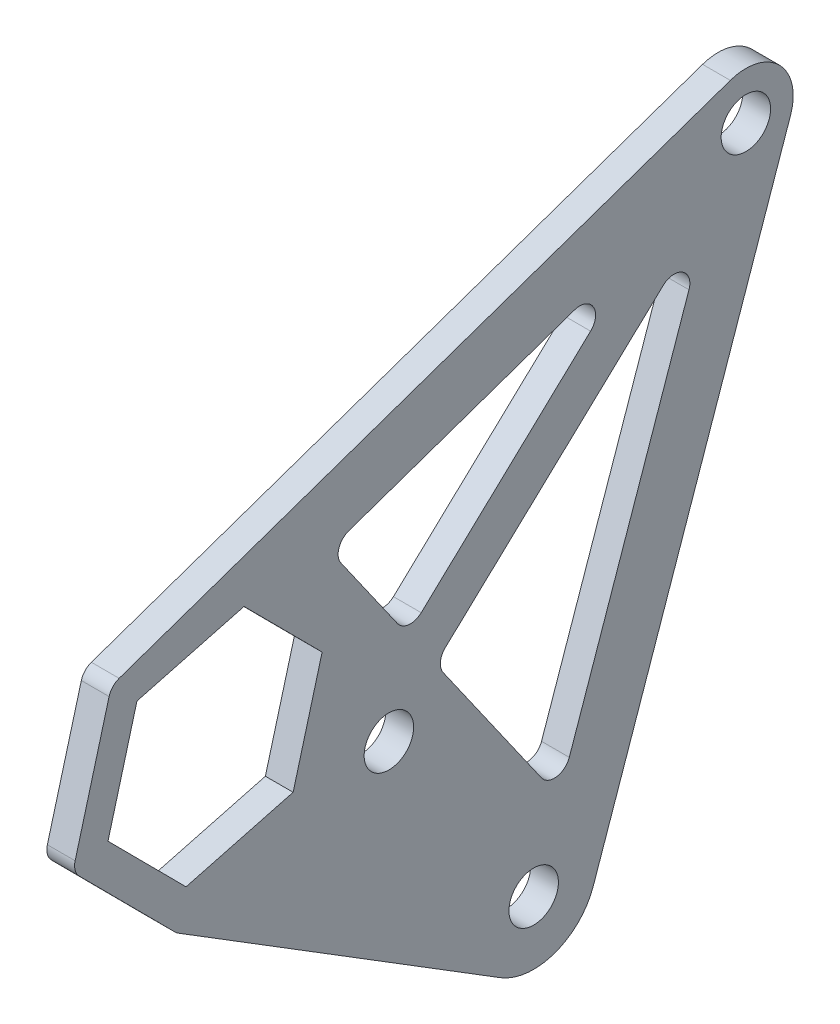
ISO-10303-21;
HEADER;
FILE_DESCRIPTION(('STEP AP214'),'2;1');
FILE_NAME('part.step','',(''),(''),'','','');
FILE_SCHEMA(('AUTOMOTIVE_DESIGN { 1 0 10303 214 1 1 1 1 }'));
ENDSEC;
DATA;
#1=APPLICATION_CONTEXT('core data for automotive mechanical design processes');
#2=APPLICATION_PROTOCOL_DEFINITION('international standard','automotive_design',2000,#1);
#3=PRODUCT_CONTEXT('',#1,'mechanical');
#4=PRODUCT('Part','Part','',(#3));
#5=PRODUCT_RELATED_PRODUCT_CATEGORY('part','',(#4));
#6=PRODUCT_DEFINITION_FORMATION('','',#4);
#7=PRODUCT_DEFINITION_CONTEXT('part definition',#1,'design');
#8=PRODUCT_DEFINITION('design','',#6,#7);
#9=PRODUCT_DEFINITION_SHAPE('','',#8);
#10=(LENGTH_UNIT() NAMED_UNIT(*) SI_UNIT(.MILLI.,.METRE.));
#11=(NAMED_UNIT(*) PLANE_ANGLE_UNIT() SI_UNIT($,.RADIAN.));
#12=(NAMED_UNIT(*) SI_UNIT($,.STERADIAN.) SOLID_ANGLE_UNIT());
#13=UNCERTAINTY_MEASURE_WITH_UNIT(LENGTH_MEASURE(1.E-05),#10,'distance_accuracy_value','');
#14=(GEOMETRIC_REPRESENTATION_CONTEXT(3) GLOBAL_UNCERTAINTY_ASSIGNED_CONTEXT((#13)) GLOBAL_UNIT_ASSIGNED_CONTEXT((#10,
#11,#12)) REPRESENTATION_CONTEXT('',''));
#15=CARTESIAN_POINT('',(0.,0.,0.));
#16=DIRECTION('',(0.,0.,1.));
#17=DIRECTION('',(1.,0.,0.));
#18=AXIS2_PLACEMENT_3D('',#15,#16,#17);
#19=CARTESIAN_POINT('',(2.794,0.,0.));
#20=DIRECTION('',(-1.,0.,0.));
#21=DIRECTION('',(0.,0.,1.));
#22=AXIS2_PLACEMENT_3D('',#19,#20,#21);
#23=CYLINDRICAL_SURFACE('',#22,4.7625);
#24=DIRECTION('',(1.,0.,0.));
#25=VECTOR('',#24,1.);
#26=CARTESIAN_POINT('',(-93.8985893371976,4.49902006163853,1.56212186943722));
#27=LINE('',#26,#25);
#28=CARTESIAN_POINT('',(0.,4.49902006163853,1.56212186943722));
#29=VERTEX_POINT('',#28);
#30=CARTESIAN_POINT('',(2.794,4.49902006163853,1.56212186943722));
#31=VERTEX_POINT('',#30);
#32=EDGE_CURVE('E278',#29,#31,#27,.T.);
#33=ORIENTED_EDGE('',*,*,#32,.T.);
#34=CARTESIAN_POINT('',(2.794,0.,0.));
#35=DIRECTION('',(1.,0.,0.));
#36=DIRECTION('',(0.,0.,-1.));
#37=AXIS2_PLACEMENT_3D('',#34,#35,#36);
#38=CIRCLE('',#37,4.7625);
#39=CARTESIAN_POINT('',(2.794,-1.56037846324955,-4.49962501786837));
#40=VERTEX_POINT('',#39);
#41=EDGE_CURVE('E329',#40,#31,#38,.T.);
#42=ORIENTED_EDGE('',*,*,#41,.F.);
#43=DIRECTION('',(-1.,0.,0.));
#44=VECTOR('',#43,1.);
#45=CARTESIAN_POINT('',(2.794,-1.56037846324955,-4.49962501786837));
#46=LINE('',#45,#44);
#47=CARTESIAN_POINT('',(0.,-1.56037846324955,-4.49962501786837));
#48=VERTEX_POINT('',#47);
#49=EDGE_CURVE('E332',#40,#48,#46,.T.);
#50=ORIENTED_EDGE('',*,*,#49,.T.);
#51=CARTESIAN_POINT('',(0.,0.,0.));
#52=DIRECTION('',(1.,0.,0.));
#53=DIRECTION('',(0.,0.,-1.));
#54=AXIS2_PLACEMENT_3D('',#51,#52,#53);
#55=CIRCLE('',#54,4.7625);
#56=EDGE_CURVE('E327',#48,#29,#55,.T.);
#57=ORIENTED_EDGE('',*,*,#56,.T.);
#58=EDGE_LOOP('',(#33,#42,#50,#57));
#59=FACE_BOUND('',#58,.T.);
#60=ADVANCED_FACE('F36',(#59),#23,.T.);
#61=CARTESIAN_POINT('',(2.794,-35.9210244842767,35.9210244842765));
#62=DIRECTION('',(1.,0.,0.));
#63=DIRECTION('',(0.,0.,-1.));
#64=AXIS2_PLACEMENT_3D('',#61,#62,#63);
#65=PLANE('',#64);
#66=DIRECTION('',(0.,-0.328004592007816,0.944676128428038));
#67=VECTOR('',#66,1.);
#68=CARTESIAN_POINT('',(2.794,-5.22008794295243,10.1943465106199));
#69=LINE('',#68,#67);
#70=CARTESIAN_POINT('',(2.794,-7.66337369974363,17.2311800965164));
#71=VERTEX_POINT('',#70);
#72=CARTESIAN_POINT('',(2.794,-15.5557205780049,39.9616902016594));
#73=VERTEX_POINT('',#72);
#74=EDGE_CURVE('E422',#71,#73,#69,.T.);
#75=ORIENTED_EDGE('',*,*,#74,.F.);
#76=CARTESIAN_POINT('',(2.794,-9.16304705362314,16.710472806704));
#77=DIRECTION('',(1.,0.,0.));
#78=DIRECTION('',(0.,0.,-1.));
#79=AXIS2_PLACEMENT_3D('',#76,#77,#78);
#80=CIRCLE('',#79,1.5875);
#81=CARTESIAN_POINT('',(2.794,-10.3201099490126,15.6235681622604));
#82=VERTEX_POINT('',#81);
#83=EDGE_CURVE('E414',#71,#82,#80,.F.);
#84=ORIENTED_EDGE('',*,*,#83,.T.);
#85=DIRECTION('',(0.,0.684664342956587,-0.728858516780743));
#86=VECTOR('',#85,1.);
#87=CARTESIAN_POINT('',(2.794,-27.5867957704279,34.004795616242));
#88=LINE('',#87,#86);
#89=CARTESIAN_POINT('',(2.794,-26.3318348130631,32.6688285961797));
#90=VERTEX_POINT('',#89);
#91=EDGE_CURVE('E449',#90,#82,#88,.T.);
#92=ORIENTED_EDGE('',*,*,#91,.F.);
#93=CARTESIAN_POINT('',(2.794,-25.1747719176737,33.7557332406233));
#94=DIRECTION('',(1.,0.,0.));
#95=DIRECTION('',(0.,0.,-1.));
#96=AXIS2_PLACEMENT_3D('',#93,#94,#95);
#97=CIRCLE('',#96,1.5875);
#98=CARTESIAN_POINT('',(2.794,-26.085324510381,35.0561371109321));
#99=VERTEX_POINT('',#98);
#100=EDGE_CURVE('E410',#90,#99,#97,.F.);
#101=ORIENTED_EDGE('',*,*,#100,.T.);
#102=DIRECTION('',(0.,-0.819152044288993,-0.573576436351044));
#103=VECTOR('',#102,1.);
#104=CARTESIAN_POINT('',(2.794,-16.2448724804067,41.9464958017111));
#105=LINE('',#104,#103);
#106=CARTESIAN_POINT('',(2.794,-17.9659465245917,40.7413867821557));
#107=VERTEX_POINT('',#106);
#108=EDGE_CURVE('E424',#107,#99,#105,.T.);
#109=ORIENTED_EDGE('',*,*,#108,.F.);
#110=CARTESIAN_POINT('',(2.794,-17.0553939318844,39.4409829118469));
#111=DIRECTION('',(1.,0.,0.));
#112=DIRECTION('',(0.,0.,-1.));
#113=AXIS2_PLACEMENT_3D('',#110,#111,#112);
#114=CIRCLE('',#113,1.5875);
#115=EDGE_CURVE('E44',#107,#73,#114,.F.);
#116=ORIENTED_EDGE('',*,*,#115,.T.);
#117=EDGE_LOOP('',(#75,#84,#92,#101,#109,#116));
#118=FACE_BOUND('',#117,.T.);
#119=DIRECTION('',(0.,-0.328004592007815,0.944676128428038));
#120=VECTOR('',#119,1.);
#121=CARTESIAN_POINT('',(2.794,4.49902006163853,1.56212186943722));
#122=LINE('',#121,#120);
#123=CARTESIAN_POINT('',(2.794,-16.8545517477094,63.0618997276822));
#124=VERTEX_POINT('',#123);
#125=EDGE_CURVE('E261',#31,#124,#122,.T.);
#126=ORIENTED_EDGE('',*,*,#125,.T.);
#127=CARTESIAN_POINT('',(2.794,-18.3542251015889,62.5411924378698));
#128=DIRECTION('',(1.,0.,0.));
#129=DIRECTION('',(0.,0.,-1.));
#130=AXIS2_PLACEMENT_3D('',#127,#128,#129);
#131=CIRCLE('',#130,1.5875);
#132=CARTESIAN_POINT('',(2.794,-17.9388019718249,64.0733738479048));
#133=VERTEX_POINT('',#132);
#134=EDGE_CURVE('E377',#124,#133,#131,.T.);
#135=ORIENTED_EDGE('',*,*,#134,.T.);
#136=DIRECTION('',(0.,-0.965153644116577,0.261683861268693));
#137=VECTOR('',#136,1.);
#138=CARTESIAN_POINT('',(2.794,-17.1295676293398,63.8539646702018));
#139=LINE('',#138,#137);
#140=CARTESIAN_POINT('',(2.794,-30.5401847282311,67.4900096520823));
#141=VERTEX_POINT('',#140);
#142=EDGE_CURVE('E270',#133,#141,#139,.T.);
#143=ORIENTED_EDGE('',*,*,#142,.T.);
#144=CARTESIAN_POINT('',(2.794,-30.9556078579952,65.9578282420473));
#145=DIRECTION('',(1.,0.,0.));
#146=DIRECTION('',(0.,0.,-1.));
#147=AXIS2_PLACEMENT_3D('',#144,#145,#146);
#148=CIRCLE('',#147,1.5875);
#149=CARTESIAN_POINT('',(2.794,-32.0748043174098,67.0836859307601));
#150=VERTEX_POINT('',#149);
#151=EDGE_CURVE('E375',#141,#150,#148,.T.);
#152=ORIENTED_EDGE('',*,*,#151,.T.);
#153=DIRECTION('',(0.,-0.709201693677379,-0.705005643725734));
#154=VECTOR('',#153,1.);
#155=CARTESIAN_POINT('',(2.794,-31.4247900777622,67.7298543078792));
#156=LINE('',#155,#154);
#157=CARTESIAN_POINT('',(2.794,-41.7969218090174,57.4190901441826));
#158=VERTEX_POINT('',#157);
#159=EDGE_CURVE('E273',#150,#158,#156,.T.);
#160=ORIENTED_EDGE('',*,*,#159,.T.);
#161=CARTESIAN_POINT('',(2.794,-40.6777253496028,56.2932324554697));
#162=DIRECTION('',(1.,0.,0.));
#163=DIRECTION('',(0.,0.,-1.));
#164=AXIS2_PLACEMENT_3D('',#161,#162,#163);
#165=CIRCLE('',#164,1.5875);
#166=CARTESIAN_POINT('',(2.794,-42.0271341685378,57.1294454004667));
#167=VERTEX_POINT('',#166);
#168=EDGE_CURVE('E373',#158,#167,#165,.T.);
#169=ORIENTED_EDGE('',*,*,#168,.T.);
#170=DIRECTION('',(0.,-0.526748311809148,-0.850021303266108));
#171=VECTOR('',#170,1.);
#172=CARTESIAN_POINT('',(2.794,-41.9290201904669,57.2877733336346));
#173=LINE('',#172,#171);
#174=CARTESIAN_POINT('',(2.794,-62.1251216849569,24.6970347809481));
#175=VERTEX_POINT('',#174);
#176=EDGE_CURVE('E276',#167,#175,#173,.T.);
#177=ORIENTED_EDGE('',*,*,#176,.T.);
#178=CARTESIAN_POINT('',(2.794,-56.7274864092171,21.35218300096));
#179=DIRECTION('',(1.,0.,0.));
#180=DIRECTION('',(0.,0.,-1.));
#181=AXIS2_PLACEMENT_3D('',#178,#179,#180);
#182=CIRCLE('',#181,6.35);
#183=CARTESIAN_POINT('',(2.794,-58.8079910268832,15.3526829771355));
#184=VERTEX_POINT('',#183);
#185=EDGE_CURVE('E324',#175,#184,#182,.T.);
#186=ORIENTED_EDGE('',*,*,#185,.T.);
#187=DIRECTION('',(0.,0.944803153358189,-0.327638522467096));
#188=VECTOR('',#187,1.);
#189=CARTESIAN_POINT('',(2.794,-58.8079910268832,15.3526829771355));
#190=LINE('',#189,#188);
#191=EDGE_CURVE('E326',#184,#40,#190,.T.);
#192=ORIENTED_EDGE('',*,*,#191,.T.);
#193=ORIENTED_EDGE('',*,*,#41,.T.);
#194=EDGE_LOOP('',(#126,#135,#143,#152,#160,#169,#177,#186,#192,#193));
#195=FACE_BOUND('',#194,.T.);
#196=DIRECTION('',(0.,0.944803153358189,-0.327638522467096));
#197=VECTOR('',#196,1.);
#198=CARTESIAN_POINT('',(2.794,-49.3234621733225,18.7846179453855));
#199=LINE('',#198,#197);
#200=CARTESIAN_POINT('',(2.794,-46.3877449099883,17.766570891752));
#201=VERTEX_POINT('',#200);
#202=CARTESIAN_POINT('',(2.794,-11.6627042397731,5.72463286756144));
#203=VERTEX_POINT('',#202);
#204=EDGE_CURVE('E297',#201,#203,#199,.T.);
#205=ORIENTED_EDGE('',*,*,#204,.F.);
#206=CARTESIAN_POINT('',(2.794,-45.8676187555718,19.2664458977081));
#207=DIRECTION('',(1.,0.,0.));
#208=DIRECTION('',(0.,0.,-1.));
#209=AXIS2_PLACEMENT_3D('',#206,#207,#208);
#210=CIRCLE('',#209,1.5875);
#211=CARTESIAN_POINT('',(2.794,-46.7781713482791,20.5668497680169));
#212=VERTEX_POINT('',#211);
#213=EDGE_CURVE('E358',#201,#212,#210,.F.);
#214=ORIENTED_EDGE('',*,*,#213,.T.);
#215=DIRECTION('',(0.,-0.819152044288993,-0.573576436351045));
#216=VECTOR('',#215,1.);
#217=CARTESIAN_POINT('',(2.794,-31.5283958619318,31.2448575195629));
#218=LINE('',#217,#216);
#219=CARTESIAN_POINT('',(2.794,-32.6546579962208,30.4562402831336));
#220=VERTEX_POINT('',#219);
#221=EDGE_CURVE('E290',#220,#212,#218,.T.);
#222=ORIENTED_EDGE('',*,*,#221,.F.);
#223=CARTESIAN_POINT('',(2.794,-31.7441054035135,29.1558364128248));
#224=DIRECTION('',(1.,0.,0.));
#225=DIRECTION('',(0.,0.,-1.));
#226=AXIS2_PLACEMENT_3D('',#223,#224,#225);
#227=CIRCLE('',#226,1.5875);
#228=CARTESIAN_POINT('',(2.794,-30.5870425081241,30.2427410572684));
#229=VERTEX_POINT('',#228);
#230=EDGE_CURVE('E366',#220,#229,#227,.F.);
#231=ORIENTED_EDGE('',*,*,#230,.T.);
#232=DIRECTION('',(0.,-0.684664342956587,0.728858516780743));
#233=VECTOR('',#232,1.);
#234=CARTESIAN_POINT('',(2.794,-5.57128904267828,3.61225393675878));
#235=LINE('',#234,#233);
#236=CARTESIAN_POINT('',(2.794,-9.98551518996712,8.31141251796114));
#237=VERTEX_POINT('',#236);
#238=EDGE_CURVE('E300',#237,#229,#235,.T.);
#239=ORIENTED_EDGE('',*,*,#238,.F.);
#240=CARTESIAN_POINT('',(2.794,-11.1425780853566,7.22450787351756));
#241=DIRECTION('',(1.,0.,0.));
#242=DIRECTION('',(0.,0.,-1.));
#243=AXIS2_PLACEMENT_3D('',#240,#241,#242);
#244=CIRCLE('',#243,1.5875);
#245=EDGE_CURVE('E362',#237,#203,#244,.F.);
#246=ORIENTED_EDGE('',*,*,#245,.T.);
#247=EDGE_LOOP('',(#205,#214,#222,#231,#239,#246));
#248=FACE_BOUND('',#247,.T.);
#249=CARTESIAN_POINT('',(2.794,-35.9210244842767,35.9210244842765));
#250=DIRECTION('',(1.,0.,0.));
#251=DIRECTION('',(0.,0.,-1.));
#252=AXIS2_PLACEMENT_3D('',#249,#250,#251);
#253=CIRCLE('',#252,2.48919999999999);
#254=CARTESIAN_POINT('',(2.794,-35.9210244842767,33.4318244842765));
#255=VERTEX_POINT('',#254);
#256=EDGE_CURVE('E312',#255,#255,#253,.T.);
#257=ORIENTED_EDGE('',*,*,#256,.F.);
#258=EDGE_LOOP('',(#257));
#259=FACE_BOUND('',#258,.T.);
#260=CARTESIAN_POINT('',(2.794,0.,0.));
#261=DIRECTION('',(1.,0.,0.));
#262=DIRECTION('',(0.,0.,-1.));
#263=AXIS2_PLACEMENT_3D('',#260,#261,#262);
#264=CIRCLE('',#263,2.4892);
#265=CARTESIAN_POINT('',(2.794,0.,-2.4892));
#266=VERTEX_POINT('',#265);
#267=EDGE_CURVE('E318',#266,#266,#264,.T.);
#268=ORIENTED_EDGE('',*,*,#267,.F.);
#269=EDGE_LOOP('',(#268));
#270=FACE_BOUND('',#269,.T.);
#271=CARTESIAN_POINT('',(2.794,-56.7274864092171,21.35218300096));
#272=DIRECTION('',(1.,0.,0.));
#273=DIRECTION('',(0.,0.,-1.));
#274=AXIS2_PLACEMENT_3D('',#271,#272,#273);
#275=CIRCLE('',#274,2.48919999999999);
#276=CARTESIAN_POINT('',(2.794,-56.7274864092171,18.86298300096));
#277=VERTEX_POINT('',#276);
#278=EDGE_CURVE('E306',#277,#277,#275,.T.);
#279=ORIENTED_EDGE('',*,*,#278,.F.);
#280=EDGE_LOOP('',(#279));
#281=FACE_BOUND('',#280,.T.);
#282=DIRECTION('',(0.,-0.709201693677379,-0.705005643725734));
#283=VECTOR('',#282,1.);
#284=CARTESIAN_POINT('',(2.794,-30.4864256382281,64.1858021762153));
#285=LINE('',#284,#283);
#286=CARTESIAN_POINT('',(2.794,-30.4864256382281,64.1858021762153));
#287=VERTEX_POINT('',#286);
#288=CARTESIAN_POINT('',(2.794,-38.3905987923425,56.3283947104471));
#289=VERTEX_POINT('',#288);
#290=EDGE_CURVE('E243',#287,#289,#285,.T.);
#291=ORIENTED_EDGE('',*,*,#290,.F.);
#292=DIRECTION('',(0.,-0.965153644116577,0.261683861268693));
#293=VECTOR('',#292,1.);
#294=CARTESIAN_POINT('',(2.794,-19.7296245879301,61.2692911617254));
#295=LINE('',#294,#293);
#296=CARTESIAN_POINT('',(2.794,-19.7296245879301,61.2692911617254));
#297=VERTEX_POINT('',#296);
#298=EDGE_CURVE('E256',#297,#287,#295,.T.);
#299=ORIENTED_EDGE('',*,*,#298,.F.);
#300=DIRECTION('',(0.,-0.255951950439197,0.966689504994427));
#301=VECTOR('',#300,1.);
#302=CARTESIAN_POINT('',(2.794,-16.8769966917466,50.4953726814672));
#303=LINE('',#302,#301);
#304=CARTESIAN_POINT('',(2.794,-16.8769966917466,50.4953726814672));
#305=VERTEX_POINT('',#304);
#306=EDGE_CURVE('E250',#305,#297,#303,.T.);
#307=ORIENTED_EDGE('',*,*,#306,.F.);
#308=DIRECTION('',(0.,0.709201693677379,0.705005643725734));
#309=VECTOR('',#308,1.);
#310=CARTESIAN_POINT('',(2.794,-24.781169845861,42.637965215699));
#311=LINE('',#310,#309);
#312=CARTESIAN_POINT('',(2.794,-24.781169845861,42.637965215699));
#313=VERTEX_POINT('',#312);
#314=EDGE_CURVE('E248',#313,#305,#311,.T.);
#315=ORIENTED_EDGE('',*,*,#314,.F.);
#316=DIRECTION('',(0.,0.965153644116577,-0.261683861268693));
#317=VECTOR('',#316,1.);
#318=CARTESIAN_POINT('',(2.794,-35.537970896159,45.5544762301889));
#319=LINE('',#318,#317);
#320=CARTESIAN_POINT('',(2.794,-35.537970896159,45.5544762301889));
#321=VERTEX_POINT('',#320);
#322=EDGE_CURVE('E228',#321,#313,#319,.T.);
#323=ORIENTED_EDGE('',*,*,#322,.F.);
#324=DIRECTION('',(0.,0.255951950439198,-0.966689504994427));
#325=VECTOR('',#324,1.);
#326=CARTESIAN_POINT('',(2.794,-38.3905987923425,56.3283947104471));
#327=LINE('',#326,#325);
#328=EDGE_CURVE('E237',#289,#321,#327,.T.);
#329=ORIENTED_EDGE('',*,*,#328,.F.);
#330=EDGE_LOOP('',(#291,#299,#307,#315,#323,#329));
#331=FACE_BOUND('',#330,.T.);
#332=ADVANCED_FACE('F245',(#118,#195,#248,#259,#270,#281,#331),#65,.T.);
#333=CARTESIAN_POINT('',(0.,-35.9210244842767,35.9210244842765));
#334=DIRECTION('',(1.,0.,0.));
#335=DIRECTION('',(0.,0.,-1.));
#336=AXIS2_PLACEMENT_3D('',#333,#334,#335);
#337=PLANE('',#336);
#338=DIRECTION('',(0.,-0.819152044288993,-0.573576436351044));
#339=VECTOR('',#338,1.);
#340=CARTESIAN_POINT('',(0.,-16.2448724804067,41.9464958017111));
#341=LINE('',#340,#339);
#342=CARTESIAN_POINT('',(0.,-17.9659465245917,40.7413867821557));
#343=VERTEX_POINT('',#342);
#344=CARTESIAN_POINT('',(0.,-26.085324510381,35.0561371109321));
#345=VERTEX_POINT('',#344);
#346=EDGE_CURVE('E439',#343,#345,#341,.T.);
#347=ORIENTED_EDGE('',*,*,#346,.T.);
#348=CARTESIAN_POINT('',(0.,-25.1747719176737,33.7557332406233));
#349=DIRECTION('',(1.,0.,0.));
#350=DIRECTION('',(0.,0.,-1.));
#351=AXIS2_PLACEMENT_3D('',#348,#349,#350);
#352=CIRCLE('',#351,1.5875);
#353=CARTESIAN_POINT('',(0.,-26.3318348130631,32.6688285961797));
#354=VERTEX_POINT('',#353);
#355=EDGE_CURVE('E412',#345,#354,#352,.T.);
#356=ORIENTED_EDGE('',*,*,#355,.T.);
#357=DIRECTION('',(0.,0.684664342956587,-0.728858516780743));
#358=VECTOR('',#357,1.);
#359=CARTESIAN_POINT('',(0.,-27.5867957704279,34.004795616242));
#360=LINE('',#359,#358);
#361=CARTESIAN_POINT('',(0.,-10.3201099490126,15.6235681622604));
#362=VERTEX_POINT('',#361);
#363=EDGE_CURVE('E445',#354,#362,#360,.T.);
#364=ORIENTED_EDGE('',*,*,#363,.T.);
#365=CARTESIAN_POINT('',(0.,-9.16304705362314,16.710472806704));
#366=DIRECTION('',(1.,0.,0.));
#367=DIRECTION('',(0.,0.,-1.));
#368=AXIS2_PLACEMENT_3D('',#365,#366,#367);
#369=CIRCLE('',#368,1.5875);
#370=CARTESIAN_POINT('',(0.,-7.66337369974363,17.2311800965164));
#371=VERTEX_POINT('',#370);
#372=EDGE_CURVE('E416',#362,#371,#369,.T.);
#373=ORIENTED_EDGE('',*,*,#372,.T.);
#374=DIRECTION('',(0.,-0.328004592007816,0.944676128428038));
#375=VECTOR('',#374,1.);
#376=CARTESIAN_POINT('',(0.,-5.22008794295243,10.1943465106199));
#377=LINE('',#376,#375);
#378=CARTESIAN_POINT('',(0.,-15.5557205780049,39.9616902016594));
#379=VERTEX_POINT('',#378);
#380=EDGE_CURVE('E441',#371,#379,#377,.T.);
#381=ORIENTED_EDGE('',*,*,#380,.T.);
#382=CARTESIAN_POINT('',(0.,-17.0553939318844,39.4409829118469));
#383=DIRECTION('',(1.,0.,0.));
#384=DIRECTION('',(0.,0.,-1.));
#385=AXIS2_PLACEMENT_3D('',#382,#383,#384);
#386=CIRCLE('',#385,1.5875);
#387=EDGE_CURVE('E11',#379,#343,#386,.T.);
#388=ORIENTED_EDGE('',*,*,#387,.T.);
#389=EDGE_LOOP('',(#347,#356,#364,#373,#381,#388));
#390=FACE_BOUND('',#389,.T.);
#391=DIRECTION('',(0.,0.965153644116577,-0.261683861268693));
#392=VECTOR('',#391,1.);
#393=CARTESIAN_POINT('',(0.,-17.1295676293398,63.8539646702018));
#394=LINE('',#393,#392);
#395=CARTESIAN_POINT('',(0.,-30.5401847282311,67.4900096520823));
#396=VERTEX_POINT('',#395);
#397=CARTESIAN_POINT('',(0.,-17.9388019718249,64.0733738479048));
#398=VERTEX_POINT('',#397);
#399=EDGE_CURVE('E285',#396,#398,#394,.T.);
#400=ORIENTED_EDGE('',*,*,#399,.T.);
#401=CARTESIAN_POINT('',(0.,-18.3542251015889,62.5411924378698));
#402=DIRECTION('',(1.,0.,0.));
#403=DIRECTION('',(0.,0.,-1.));
#404=AXIS2_PLACEMENT_3D('',#401,#402,#403);
#405=CIRCLE('',#404,1.5875);
#406=CARTESIAN_POINT('',(0.,-16.8545517477094,63.0618997276822));
#407=VERTEX_POINT('',#406);
#408=EDGE_CURVE('E387',#398,#407,#405,.F.);
#409=ORIENTED_EDGE('',*,*,#408,.T.);
#410=DIRECTION('',(0.,0.328004592007815,-0.944676128428038));
#411=VECTOR('',#410,1.);
#412=CARTESIAN_POINT('',(0.,4.49902006163853,1.56212186943722));
#413=LINE('',#412,#411);
#414=EDGE_CURVE('E301',#407,#29,#413,.T.);
#415=ORIENTED_EDGE('',*,*,#414,.T.);
#416=ORIENTED_EDGE('',*,*,#56,.F.);
#417=DIRECTION('',(0.,0.944803153358189,-0.327638522467096));
#418=VECTOR('',#417,1.);
#419=CARTESIAN_POINT('',(0.,-58.8079910268832,15.3526829771355));
#420=LINE('',#419,#418);
#421=CARTESIAN_POINT('',(0.,-58.8079910268832,15.3526829771355));
#422=VERTEX_POINT('',#421);
#423=EDGE_CURVE('E334',#422,#48,#420,.T.);
#424=ORIENTED_EDGE('',*,*,#423,.F.);
#425=CARTESIAN_POINT('',(0.,-56.7274864092171,21.35218300096));
#426=DIRECTION('',(1.,0.,0.));
#427=DIRECTION('',(0.,0.,-1.));
#428=AXIS2_PLACEMENT_3D('',#425,#426,#427);
#429=CIRCLE('',#428,6.35);
#430=CARTESIAN_POINT('',(0.,-62.1251216849569,24.6970347809481));
#431=VERTEX_POINT('',#430);
#432=EDGE_CURVE('E321',#431,#422,#429,.T.);
#433=ORIENTED_EDGE('',*,*,#432,.F.);
#434=DIRECTION('',(0.,0.526748311809148,0.850021303266108));
#435=VECTOR('',#434,1.);
#436=CARTESIAN_POINT('',(0.,-41.9290201904669,57.2877733336346));
#437=LINE('',#436,#435);
#438=CARTESIAN_POINT('',(0.,-42.0271341685378,57.1294454004667));
#439=VERTEX_POINT('',#438);
#440=EDGE_CURVE('E468',#431,#439,#437,.T.);
#441=ORIENTED_EDGE('',*,*,#440,.T.);
#442=CARTESIAN_POINT('',(0.,-40.6777253496028,56.2932324554697));
#443=DIRECTION('',(1.,0.,0.));
#444=DIRECTION('',(0.,0.,-1.));
#445=AXIS2_PLACEMENT_3D('',#442,#443,#444);
#446=CIRCLE('',#445,1.5875);
#447=CARTESIAN_POINT('',(0.,-41.7969218090174,57.4190901441826));
#448=VERTEX_POINT('',#447);
#449=EDGE_CURVE('E58',#439,#448,#446,.F.);
#450=ORIENTED_EDGE('',*,*,#449,.T.);
#451=DIRECTION('',(0.,0.70920169367738,0.705005643725734));
#452=VECTOR('',#451,1.);
#453=CARTESIAN_POINT('',(0.,-31.4247900777622,67.7298543078792));
#454=LINE('',#453,#452);
#455=CARTESIAN_POINT('',(0.,-32.0748043174098,67.0836859307601));
#456=VERTEX_POINT('',#455);
#457=EDGE_CURVE('E472',#448,#456,#454,.T.);
#458=ORIENTED_EDGE('',*,*,#457,.T.);
#459=CARTESIAN_POINT('',(0.,-30.9556078579952,65.9578282420473));
#460=DIRECTION('',(1.,0.,0.));
#461=DIRECTION('',(0.,0.,-1.));
#462=AXIS2_PLACEMENT_3D('',#459,#460,#461);
#463=CIRCLE('',#462,1.5875);
#464=EDGE_CURVE('E385',#456,#396,#463,.F.);
#465=ORIENTED_EDGE('',*,*,#464,.T.);
#466=EDGE_LOOP('',(#400,#409,#415,#416,#424,#433,#441,#450,#458,#465));
#467=FACE_BOUND('',#466,.T.);
#468=DIRECTION('',(0.,-0.684664342956587,0.728858516780743));
#469=VECTOR('',#468,1.);
#470=CARTESIAN_POINT('',(0.,-5.57128904267828,3.61225393675878));
#471=LINE('',#470,#469);
#472=CARTESIAN_POINT('',(0.,-9.98551518996712,8.31141251796114));
#473=VERTEX_POINT('',#472);
#474=CARTESIAN_POINT('',(0.,-30.5870425081241,30.2427410572684));
#475=VERTEX_POINT('',#474);
#476=EDGE_CURVE('E289',#473,#475,#471,.T.);
#477=ORIENTED_EDGE('',*,*,#476,.T.);
#478=CARTESIAN_POINT('',(0.,-31.7441054035135,29.1558364128248));
#479=DIRECTION('',(1.,0.,0.));
#480=DIRECTION('',(0.,0.,-1.));
#481=AXIS2_PLACEMENT_3D('',#478,#479,#480);
#482=CIRCLE('',#481,1.5875);
#483=CARTESIAN_POINT('',(0.,-32.6546579962208,30.4562402831336));
#484=VERTEX_POINT('',#483);
#485=EDGE_CURVE('E368',#475,#484,#482,.T.);
#486=ORIENTED_EDGE('',*,*,#485,.T.);
#487=DIRECTION('',(0.,-0.819152044288993,-0.573576436351045));
#488=VECTOR('',#487,1.);
#489=CARTESIAN_POINT('',(0.,-31.5283958619318,31.2448575195629));
#490=LINE('',#489,#488);
#491=CARTESIAN_POINT('',(0.,-46.7781713482791,20.5668497680169));
#492=VERTEX_POINT('',#491);
#493=EDGE_CURVE('E293',#484,#492,#490,.T.);
#494=ORIENTED_EDGE('',*,*,#493,.T.);
#495=CARTESIAN_POINT('',(0.,-45.8676187555718,19.2664458977081));
#496=DIRECTION('',(1.,0.,0.));
#497=DIRECTION('',(0.,0.,-1.));
#498=AXIS2_PLACEMENT_3D('',#495,#496,#497);
#499=CIRCLE('',#498,1.5875);
#500=CARTESIAN_POINT('',(0.,-46.3877449099883,17.766570891752));
#501=VERTEX_POINT('',#500);
#502=EDGE_CURVE('E360',#492,#501,#499,.T.);
#503=ORIENTED_EDGE('',*,*,#502,.T.);
#504=DIRECTION('',(0.,0.944803153358189,-0.327638522467096));
#505=VECTOR('',#504,1.);
#506=CARTESIAN_POINT('',(0.,-49.3234621733225,18.7846179453855));
#507=LINE('',#506,#505);
#508=CARTESIAN_POINT('',(0.,-11.6627042397731,5.72463286756144));
#509=VERTEX_POINT('',#508);
#510=EDGE_CURVE('E286',#501,#509,#507,.T.);
#511=ORIENTED_EDGE('',*,*,#510,.T.);
#512=CARTESIAN_POINT('',(0.,-11.1425780853566,7.22450787351756));
#513=DIRECTION('',(1.,0.,0.));
#514=DIRECTION('',(0.,0.,-1.));
#515=AXIS2_PLACEMENT_3D('',#512,#513,#514);
#516=CIRCLE('',#515,1.5875);
#517=EDGE_CURVE('E364',#509,#473,#516,.T.);
#518=ORIENTED_EDGE('',*,*,#517,.T.);
#519=EDGE_LOOP('',(#477,#486,#494,#503,#511,#518));
#520=FACE_BOUND('',#519,.T.);
#521=CARTESIAN_POINT('',(0.,0.,0.));
#522=DIRECTION('',(1.,0.,0.));
#523=DIRECTION('',(0.,0.,-1.));
#524=AXIS2_PLACEMENT_3D('',#521,#522,#523);
#525=CIRCLE('',#524,2.4892);
#526=CARTESIAN_POINT('',(0.,0.,-2.4892));
#527=VERTEX_POINT('',#526);
#528=EDGE_CURVE('E315',#527,#527,#525,.T.);
#529=ORIENTED_EDGE('',*,*,#528,.T.);
#530=EDGE_LOOP('',(#529));
#531=FACE_BOUND('',#530,.T.);
#532=CARTESIAN_POINT('',(0.,-35.9210244842767,35.9210244842765));
#533=DIRECTION('',(1.,0.,0.));
#534=DIRECTION('',(0.,0.,-1.));
#535=AXIS2_PLACEMENT_3D('',#532,#533,#534);
#536=CIRCLE('',#535,2.48919999999999);
#537=CARTESIAN_POINT('',(0.,-35.9210244842767,33.4318244842765));
#538=VERTEX_POINT('',#537);
#539=EDGE_CURVE('E309',#538,#538,#536,.T.);
#540=ORIENTED_EDGE('',*,*,#539,.T.);
#541=EDGE_LOOP('',(#540));
#542=FACE_BOUND('',#541,.T.);
#543=CARTESIAN_POINT('',(0.,-56.7274864092171,21.35218300096));
#544=DIRECTION('',(1.,0.,0.));
#545=DIRECTION('',(0.,0.,-1.));
#546=AXIS2_PLACEMENT_3D('',#543,#544,#545);
#547=CIRCLE('',#546,2.48919999999999);
#548=CARTESIAN_POINT('',(0.,-56.7274864092171,18.86298300096));
#549=VERTEX_POINT('',#548);
#550=EDGE_CURVE('E296',#549,#549,#547,.T.);
#551=ORIENTED_EDGE('',*,*,#550,.T.);
#552=EDGE_LOOP('',(#551));
#553=FACE_BOUND('',#552,.T.);
#554=DIRECTION('',(0.,-0.255951950439198,0.966689504994427));
#555=VECTOR('',#554,1.);
#556=CARTESIAN_POINT('',(0.,-38.3905987923425,56.3283947104471));
#557=LINE('',#556,#555);
#558=CARTESIAN_POINT('',(0.,-35.537970896159,45.5544762301889));
#559=VERTEX_POINT('',#558);
#560=CARTESIAN_POINT('',(0.,-38.3905987923425,56.3283947104471));
#561=VERTEX_POINT('',#560);
#562=EDGE_CURVE('E282',#559,#561,#557,.T.);
#563=ORIENTED_EDGE('',*,*,#562,.F.);
#564=DIRECTION('',(0.,-0.965153644116577,0.261683861268693));
#565=VECTOR('',#564,1.);
#566=CARTESIAN_POINT('',(0.,-35.537970896159,45.5544762301889));
#567=LINE('',#566,#565);
#568=CARTESIAN_POINT('',(0.,-24.781169845861,42.637965215699));
#569=VERTEX_POINT('',#568);
#570=EDGE_CURVE('E230',#569,#559,#567,.T.);
#571=ORIENTED_EDGE('',*,*,#570,.F.);
#572=DIRECTION('',(0.,-0.709201693677379,-0.705005643725734));
#573=VECTOR('',#572,1.);
#574=CARTESIAN_POINT('',(0.,-24.781169845861,42.637965215699));
#575=LINE('',#574,#573);
#576=CARTESIAN_POINT('',(0.,-16.8769966917466,50.4953726814672));
#577=VERTEX_POINT('',#576);
#578=EDGE_CURVE('E456',#577,#569,#575,.T.);
#579=ORIENTED_EDGE('',*,*,#578,.F.);
#580=DIRECTION('',(0.,0.255951950439198,-0.966689504994427));
#581=VECTOR('',#580,1.);
#582=CARTESIAN_POINT('',(0.,-16.8769966917466,50.4953726814672));
#583=LINE('',#582,#581);
#584=CARTESIAN_POINT('',(0.,-19.7296245879301,61.2692911617254));
#585=VERTEX_POINT('',#584);
#586=EDGE_CURVE('E459',#585,#577,#583,.T.);
#587=ORIENTED_EDGE('',*,*,#586,.F.);
#588=DIRECTION('',(0.,0.965153644116577,-0.261683861268693));
#589=VECTOR('',#588,1.);
#590=CARTESIAN_POINT('',(0.,-19.7296245879301,61.2692911617254));
#591=LINE('',#590,#589);
#592=CARTESIAN_POINT('',(0.,-30.4864256382281,64.1858021762153));
#593=VERTEX_POINT('',#592);
#594=EDGE_CURVE('E462',#593,#585,#591,.T.);
#595=ORIENTED_EDGE('',*,*,#594,.F.);
#596=DIRECTION('',(0.,0.709201693677379,0.705005643725734));
#597=VECTOR('',#596,1.);
#598=CARTESIAN_POINT('',(0.,-30.4864256382281,64.1858021762153));
#599=LINE('',#598,#597);
#600=EDGE_CURVE('E465',#561,#593,#599,.T.);
#601=ORIENTED_EDGE('',*,*,#600,.F.);
#602=EDGE_LOOP('',(#563,#571,#579,#587,#595,#601));
#603=FACE_BOUND('',#602,.T.);
#604=ADVANCED_FACE('F438',(#390,#467,#520,#531,#542,#553,#603),#337,.F.);
#605=CARTESIAN_POINT('',(2.794,-56.7274864092171,21.35218300096));
#606=DIRECTION('',(-1.,0.,0.));
#607=DIRECTION('',(0.,0.,1.));
#608=AXIS2_PLACEMENT_3D('',#605,#606,#607);
#609=CYLINDRICAL_SURFACE('',#608,6.35);
#610=ORIENTED_EDGE('',*,*,#185,.F.);
#611=DIRECTION('',(1.,0.,0.));
#612=VECTOR('',#611,1.);
#613=CARTESIAN_POINT('',(-93.8985893371976,-62.1251216849569,24.6970347809481));
#614=LINE('',#613,#612);
#615=EDGE_CURVE('E279',#431,#175,#614,.T.);
#616=ORIENTED_EDGE('',*,*,#615,.F.);
#617=ORIENTED_EDGE('',*,*,#432,.T.);
#618=DIRECTION('',(-1.,0.,0.));
#619=VECTOR('',#618,1.);
#620=CARTESIAN_POINT('',(2.794,-58.8079910268832,15.3526829771355));
#621=LINE('',#620,#619);
#622=EDGE_CURVE('E340',#184,#422,#621,.T.);
#623=ORIENTED_EDGE('',*,*,#622,.F.);
#624=EDGE_LOOP('',(#610,#616,#617,#623));
#625=FACE_BOUND('',#624,.T.);
#626=ADVANCED_FACE('F488',(#625),#609,.T.);
#627=CARTESIAN_POINT('',(2.794,-58.8079910268832,15.3526829771355));
#628=DIRECTION('',(0.,0.327638522467096,0.944803153358189));
#629=DIRECTION('',(0.,-0.944803153358189,0.327638522467096));
#630=AXIS2_PLACEMENT_3D('',#627,#628,#629);
#631=PLANE('',#630);
#632=ORIENTED_EDGE('',*,*,#423,.T.);
#633=ORIENTED_EDGE('',*,*,#49,.F.);
#634=ORIENTED_EDGE('',*,*,#191,.F.);
#635=ORIENTED_EDGE('',*,*,#622,.T.);
#636=EDGE_LOOP('',(#632,#633,#634,#635));
#637=FACE_BOUND('',#636,.T.);
#638=ADVANCED_FACE('F494',(#637),#631,.F.);
#639=CARTESIAN_POINT('',(2.794,0.,0.));
#640=DIRECTION('',(-1.,0.,0.));
#641=DIRECTION('',(0.,0.,1.));
#642=AXIS2_PLACEMENT_3D('',#639,#640,#641);
#643=CYLINDRICAL_SURFACE('',#642,2.4892);
#644=ORIENTED_EDGE('',*,*,#267,.T.);
#645=EDGE_LOOP('',(#644));
#646=FACE_BOUND('',#645,.T.);
#647=ORIENTED_EDGE('',*,*,#528,.F.);
#648=EDGE_LOOP('',(#647));
#649=FACE_BOUND('',#648,.T.);
#650=ADVANCED_FACE('F505',(#646,#649),#643,.F.);
#651=CARTESIAN_POINT('',(2.794,-35.9210244842767,35.9210244842765));
#652=DIRECTION('',(-1.,0.,0.));
#653=DIRECTION('',(0.,0.,1.));
#654=AXIS2_PLACEMENT_3D('',#651,#652,#653);
#655=CYLINDRICAL_SURFACE('',#654,2.48919999999999);
#656=ORIENTED_EDGE('',*,*,#256,.T.);
#657=EDGE_LOOP('',(#656));
#658=FACE_BOUND('',#657,.T.);
#659=ORIENTED_EDGE('',*,*,#539,.F.);
#660=EDGE_LOOP('',(#659));
#661=FACE_BOUND('',#660,.T.);
#662=ADVANCED_FACE('F599',(#658,#661),#655,.F.);
#663=CARTESIAN_POINT('',(2.794,-56.7274864092171,21.35218300096));
#664=DIRECTION('',(-1.,0.,0.));
#665=DIRECTION('',(0.,0.,1.));
#666=AXIS2_PLACEMENT_3D('',#663,#664,#665);
#667=CYLINDRICAL_SURFACE('',#666,2.48919999999999);
#668=ORIENTED_EDGE('',*,*,#278,.T.);
#669=EDGE_LOOP('',(#668));
#670=FACE_BOUND('',#669,.T.);
#671=ORIENTED_EDGE('',*,*,#550,.F.);
#672=EDGE_LOOP('',(#671));
#673=FACE_BOUND('',#672,.T.);
#674=ADVANCED_FACE('F595',(#670,#673),#667,.F.);
#675=CARTESIAN_POINT('',(0.,-49.3234621733225,18.7846179453855));
#676=DIRECTION('',(0.,-0.327638522467096,-0.944803153358189));
#677=DIRECTION('',(0.,0.944803153358189,-0.327638522467096));
#678=AXIS2_PLACEMENT_3D('',#675,#676,#677);
#679=PLANE('',#678);
#680=ORIENTED_EDGE('',*,*,#510,.F.);
#681=DIRECTION('',(1.,0.,0.));
#682=VECTOR('',#681,1.);
#683=CARTESIAN_POINT('',(2.794,-46.3877449099883,17.766570891752));
#684=LINE('',#683,#682);
#685=EDGE_CURVE('E345',#501,#201,#684,.T.);
#686=ORIENTED_EDGE('',*,*,#685,.T.);
#687=ORIENTED_EDGE('',*,*,#204,.T.);
#688=DIRECTION('',(1.,0.,0.));
#689=VECTOR('',#688,1.);
#690=CARTESIAN_POINT('',(0.,-11.6627042397731,5.72463286756144));
#691=LINE('',#690,#689);
#692=EDGE_CURVE('E343',#203,#509,#691,.F.);
#693=ORIENTED_EDGE('',*,*,#692,.T.);
#694=EDGE_LOOP('',(#680,#686,#687,#693));
#695=FACE_BOUND('',#694,.T.);
#696=ADVANCED_FACE('F588',(#695),#679,.F.);
#697=CARTESIAN_POINT('',(0.,-31.5283958619318,31.2448575195629));
#698=DIRECTION('',(0.,-0.573576436351045,0.819152044288993));
#699=DIRECTION('',(0.,-0.819152044288993,-0.573576436351045));
#700=AXIS2_PLACEMENT_3D('',#697,#698,#699);
#701=PLANE('',#700);
#702=ORIENTED_EDGE('',*,*,#221,.T.);
#703=DIRECTION('',(1.,0.,0.));
#704=VECTOR('',#703,1.);
#705=CARTESIAN_POINT('',(0.,-46.7781713482791,20.5668497680169));
#706=LINE('',#705,#704);
#707=EDGE_CURVE('E351',#212,#492,#706,.F.);
#708=ORIENTED_EDGE('',*,*,#707,.T.);
#709=ORIENTED_EDGE('',*,*,#493,.F.);
#710=DIRECTION('',(1.,0.,0.));
#711=VECTOR('',#710,1.);
#712=CARTESIAN_POINT('',(2.794,-32.6546579962208,30.4562402831336));
#713=LINE('',#712,#711);
#714=EDGE_CURVE('E348',#484,#220,#713,.T.);
#715=ORIENTED_EDGE('',*,*,#714,.T.);
#716=EDGE_LOOP('',(#702,#708,#709,#715));
#717=FACE_BOUND('',#716,.T.);
#718=ADVANCED_FACE('F585',(#717),#701,.F.);
#719=CARTESIAN_POINT('',(0.,-5.57128904267828,3.61225393675878));
#720=DIRECTION('',(0.,0.728858516780743,0.684664342956587));
#721=DIRECTION('',(0.,-0.684664342956587,0.728858516780743));
#722=AXIS2_PLACEMENT_3D('',#719,#720,#721);
#723=PLANE('',#722);
#724=ORIENTED_EDGE('',*,*,#476,.F.);
#725=DIRECTION('',(1.,0.,0.));
#726=VECTOR('',#725,1.);
#727=CARTESIAN_POINT('',(2.794,-9.98551518996712,8.31141251796114));
#728=LINE('',#727,#726);
#729=EDGE_CURVE('E355',#473,#237,#728,.T.);
#730=ORIENTED_EDGE('',*,*,#729,.T.);
#731=ORIENTED_EDGE('',*,*,#238,.T.);
#732=DIRECTION('',(1.,0.,0.));
#733=VECTOR('',#732,1.);
#734=CARTESIAN_POINT('',(0.,-30.5870425081241,30.2427410572684));
#735=LINE('',#734,#733);
#736=EDGE_CURVE('E353',#229,#475,#735,.F.);
#737=ORIENTED_EDGE('',*,*,#736,.T.);
#738=EDGE_LOOP('',(#724,#730,#731,#737));
#739=FACE_BOUND('',#738,.T.);
#740=ADVANCED_FACE('F583',(#739),#723,.F.);
#741=CARTESIAN_POINT('',(-93.8985893371976,4.49902006163853,1.56212186943722));
#742=DIRECTION('',(0.,0.944676128428038,0.328004592007815));
#743=DIRECTION('',(0.,-0.328004592007815,0.944676128428038));
#744=AXIS2_PLACEMENT_3D('',#741,#742,#743);
#745=PLANE('',#744);
#746=ORIENTED_EDGE('',*,*,#414,.F.);
#747=DIRECTION('',(1.,0.,0.));
#748=VECTOR('',#747,1.);
#749=CARTESIAN_POINT('',(-93.8985893371976,-16.8545517477094,63.0618997276822));
#750=LINE('',#749,#748);
#751=EDGE_CURVE('E370',#407,#124,#750,.T.);
#752=ORIENTED_EDGE('',*,*,#751,.T.);
#753=ORIENTED_EDGE('',*,*,#125,.F.);
#754=ORIENTED_EDGE('',*,*,#32,.F.);
#755=EDGE_LOOP('',(#746,#752,#753,#754));
#756=FACE_BOUND('',#755,.T.);
#757=ADVANCED_FACE('F579',(#756),#745,.T.);
#758=CARTESIAN_POINT('',(-93.8985893371976,-17.1295676293398,63.8539646702018));
#759=DIRECTION('',(0.,0.261683861268693,0.965153644116577));
#760=DIRECTION('',(0.,-0.965153644116577,0.261683861268693));
#761=AXIS2_PLACEMENT_3D('',#758,#759,#760);
#762=PLANE('',#761);
#763=ORIENTED_EDGE('',*,*,#142,.F.);
#764=DIRECTION('',(1.,0.,0.));
#765=VECTOR('',#764,1.);
#766=CARTESIAN_POINT('',(-93.8985893371976,-17.9388019718249,64.0733738479048));
#767=LINE('',#766,#765);
#768=EDGE_CURVE('E382',#133,#398,#767,.F.);
#769=ORIENTED_EDGE('',*,*,#768,.T.);
#770=ORIENTED_EDGE('',*,*,#399,.F.);
#771=DIRECTION('',(1.,0.,0.));
#772=VECTOR('',#771,1.);
#773=CARTESIAN_POINT('',(-93.8985893371976,-30.5401847282311,67.4900096520823));
#774=LINE('',#773,#772);
#775=EDGE_CURVE('E379',#396,#141,#774,.T.);
#776=ORIENTED_EDGE('',*,*,#775,.T.);
#777=EDGE_LOOP('',(#763,#769,#770,#776));
#778=FACE_BOUND('',#777,.T.);
#779=ADVANCED_FACE('F576',(#778),#762,.T.);
#780=CARTESIAN_POINT('',(-93.8985893371976,-31.4247900777622,67.7298543078792));
#781=DIRECTION('',(0.,-0.705005643725734,0.70920169367738));
#782=DIRECTION('',(0.,-0.70920169367738,-0.705005643725734));
#783=AXIS2_PLACEMENT_3D('',#780,#781,#782);
#784=PLANE('',#783);
#785=ORIENTED_EDGE('',*,*,#159,.F.);
#786=DIRECTION('',(1.,0.,0.));
#787=VECTOR('',#786,1.);
#788=CARTESIAN_POINT('',(-93.8985893371976,-32.0748043174098,67.0836859307601));
#789=LINE('',#788,#787);
#790=EDGE_CURVE('E51',#150,#456,#789,.F.);
#791=ORIENTED_EDGE('',*,*,#790,.T.);
#792=ORIENTED_EDGE('',*,*,#457,.F.);
#793=DIRECTION('',(1.,0.,0.));
#794=VECTOR('',#793,1.);
#795=CARTESIAN_POINT('',(-93.8985893371976,-41.7969218090174,57.4190901441826));
#796=LINE('',#795,#794);
#797=EDGE_CURVE('E389',#448,#158,#796,.T.);
#798=ORIENTED_EDGE('',*,*,#797,.T.);
#799=EDGE_LOOP('',(#785,#791,#792,#798));
#800=FACE_BOUND('',#799,.T.);
#801=ADVANCED_FACE('F572',(#800),#784,.T.);
#802=CARTESIAN_POINT('',(-93.8985893371976,-41.9290201904669,57.2877733336346));
#803=DIRECTION('',(0.,-0.850021303266108,0.526748311809148));
#804=DIRECTION('',(0.,-0.526748311809148,-0.850021303266108));
#805=AXIS2_PLACEMENT_3D('',#802,#803,#804);
#806=PLANE('',#805);
#807=ORIENTED_EDGE('',*,*,#176,.F.);
#808=DIRECTION('',(1.,0.,0.));
#809=VECTOR('',#808,1.);
#810=CARTESIAN_POINT('',(-93.8985893371976,-42.0271341685378,57.1294454004667));
#811=LINE('',#810,#809);
#812=EDGE_CURVE('E393',#167,#439,#811,.F.);
#813=ORIENTED_EDGE('',*,*,#812,.T.);
#814=ORIENTED_EDGE('',*,*,#440,.F.);
#815=ORIENTED_EDGE('',*,*,#615,.T.);
#816=EDGE_LOOP('',(#807,#813,#814,#815));
#817=FACE_BOUND('',#816,.T.);
#818=ADVANCED_FACE('F567',(#817),#806,.T.);
#819=CARTESIAN_POINT('',(-93.8985893371976,-38.3905987923425,56.3283947104471));
#820=DIRECTION('',(0.,-0.966689504994427,-0.255951950439198));
#821=DIRECTION('',(0.,0.255951950439198,-0.966689504994427));
#822=AXIS2_PLACEMENT_3D('',#819,#820,#821);
#823=PLANE('',#822);
#824=DIRECTION('',(1.,0.,0.));
#825=VECTOR('',#824,1.);
#826=CARTESIAN_POINT('',(-93.8985893371976,-35.537970896159,45.5544762301889));
#827=LINE('',#826,#825);
#828=EDGE_CURVE('E223',#559,#321,#827,.T.);
#829=ORIENTED_EDGE('',*,*,#828,.F.);
#830=ORIENTED_EDGE('',*,*,#562,.T.);
#831=DIRECTION('',(1.,0.,0.));
#832=VECTOR('',#831,1.);
#833=CARTESIAN_POINT('',(-93.8985893371976,-38.3905987923425,56.3283947104471));
#834=LINE('',#833,#832);
#835=EDGE_CURVE('E234',#561,#289,#834,.T.);
#836=ORIENTED_EDGE('',*,*,#835,.T.);
#837=ORIENTED_EDGE('',*,*,#328,.T.);
#838=EDGE_LOOP('',(#829,#830,#836,#837));
#839=FACE_BOUND('',#838,.T.);
#840=ADVANCED_FACE('F238',(#839),#823,.F.);
#841=CARTESIAN_POINT('',(-93.8985893371976,-35.537970896159,45.5544762301889));
#842=DIRECTION('',(0.,-0.261683861268693,-0.965153644116577));
#843=DIRECTION('',(0.,0.965153644116577,-0.261683861268693));
#844=AXIS2_PLACEMENT_3D('',#841,#842,#843);
#845=PLANE('',#844);
#846=DIRECTION('',(1.,0.,0.));
#847=VECTOR('',#846,1.);
#848=CARTESIAN_POINT('',(-93.8985893371976,-24.781169845861,42.637965215699));
#849=LINE('',#848,#847);
#850=EDGE_CURVE('E233',#569,#313,#849,.T.);
#851=ORIENTED_EDGE('',*,*,#850,.F.);
#852=ORIENTED_EDGE('',*,*,#570,.T.);
#853=ORIENTED_EDGE('',*,*,#828,.T.);
#854=ORIENTED_EDGE('',*,*,#322,.T.);
#855=EDGE_LOOP('',(#851,#852,#853,#854));
#856=FACE_BOUND('',#855,.T.);
#857=ADVANCED_FACE('F226',(#856),#845,.F.);
#858=CARTESIAN_POINT('',(-93.8985893371976,-24.781169845861,42.637965215699));
#859=DIRECTION('',(0.,0.705005643725734,-0.709201693677379));
#860=DIRECTION('',(0.,0.709201693677379,0.705005643725734));
#861=AXIS2_PLACEMENT_3D('',#858,#859,#860);
#862=PLANE('',#861);
#863=DIRECTION('',(1.,0.,0.));
#864=VECTOR('',#863,1.);
#865=CARTESIAN_POINT('',(-93.8985893371976,-16.8769966917466,50.4953726814672));
#866=LINE('',#865,#864);
#867=EDGE_CURVE('E264',#577,#305,#866,.T.);
#868=ORIENTED_EDGE('',*,*,#867,.F.);
#869=ORIENTED_EDGE('',*,*,#578,.T.);
#870=ORIENTED_EDGE('',*,*,#850,.T.);
#871=ORIENTED_EDGE('',*,*,#314,.T.);
#872=EDGE_LOOP('',(#868,#869,#870,#871));
#873=FACE_BOUND('',#872,.T.);
#874=ADVANCED_FACE('F485',(#873),#862,.F.);
#875=CARTESIAN_POINT('',(-93.8985893371976,-16.8769966917466,50.4953726814672));
#876=DIRECTION('',(0.,0.966689504994427,0.255951950439197));
#877=DIRECTION('',(0.,-0.255951950439198,0.966689504994427));
#878=AXIS2_PLACEMENT_3D('',#875,#876,#877);
#879=PLANE('',#878);
#880=DIRECTION('',(1.,0.,0.));
#881=VECTOR('',#880,1.);
#882=CARTESIAN_POINT('',(-93.8985893371976,-19.7296245879301,61.2692911617254));
#883=LINE('',#882,#881);
#884=EDGE_CURVE('E262',#585,#297,#883,.T.);
#885=ORIENTED_EDGE('',*,*,#884,.F.);
#886=ORIENTED_EDGE('',*,*,#586,.T.);
#887=ORIENTED_EDGE('',*,*,#867,.T.);
#888=ORIENTED_EDGE('',*,*,#306,.T.);
#889=EDGE_LOOP('',(#885,#886,#887,#888));
#890=FACE_BOUND('',#889,.T.);
#891=ADVANCED_FACE('F482',(#890),#879,.F.);
#892=CARTESIAN_POINT('',(-93.8985893371976,-19.7296245879301,61.2692911617254));
#893=DIRECTION('',(0.,0.261683861268693,0.965153644116577));
#894=DIRECTION('',(0.,-0.965153644116577,0.261683861268693));
#895=AXIS2_PLACEMENT_3D('',#892,#893,#894);
#896=PLANE('',#895);
#897=DIRECTION('',(1.,0.,0.));
#898=VECTOR('',#897,1.);
#899=CARTESIAN_POINT('',(-93.8985893371976,-30.4864256382281,64.1858021762153));
#900=LINE('',#899,#898);
#901=EDGE_CURVE('E259',#593,#287,#900,.T.);
#902=ORIENTED_EDGE('',*,*,#901,.F.);
#903=ORIENTED_EDGE('',*,*,#594,.T.);
#904=ORIENTED_EDGE('',*,*,#884,.T.);
#905=ORIENTED_EDGE('',*,*,#298,.T.);
#906=EDGE_LOOP('',(#902,#903,#904,#905));
#907=FACE_BOUND('',#906,.T.);
#908=ADVANCED_FACE('F479',(#907),#896,.F.);
#909=CARTESIAN_POINT('',(-93.8985893371976,-30.4864256382281,64.1858021762153));
#910=DIRECTION('',(0.,-0.705005643725734,0.709201693677379));
#911=DIRECTION('',(0.,-0.709201693677379,-0.705005643725734));
#912=AXIS2_PLACEMENT_3D('',#909,#910,#911);
#913=PLANE('',#912);
#914=ORIENTED_EDGE('',*,*,#835,.F.);
#915=ORIENTED_EDGE('',*,*,#600,.T.);
#916=ORIENTED_EDGE('',*,*,#901,.T.);
#917=ORIENTED_EDGE('',*,*,#290,.T.);
#918=EDGE_LOOP('',(#914,#915,#916,#917));
#919=FACE_BOUND('',#918,.T.);
#920=ADVANCED_FACE('F475',(#919),#913,.F.);
#921=CARTESIAN_POINT('',(0.,-5.22008794295243,10.1943465106199));
#922=DIRECTION('',(0.,0.944676128428038,0.328004592007815));
#923=DIRECTION('',(0.,-0.328004592007815,0.944676128428038));
#924=AXIS2_PLACEMENT_3D('',#921,#922,#923);
#925=PLANE('',#924);
#926=ORIENTED_EDGE('',*,*,#380,.F.);
#927=DIRECTION('',(1.,0.,0.));
#928=VECTOR('',#927,1.);
#929=CARTESIAN_POINT('',(2.794,-7.66337369974363,17.2311800965164));
#930=LINE('',#929,#928);
#931=EDGE_CURVE('E407',#371,#71,#930,.T.);
#932=ORIENTED_EDGE('',*,*,#931,.T.);
#933=ORIENTED_EDGE('',*,*,#74,.T.);
#934=DIRECTION('',(1.,0.,0.));
#935=VECTOR('',#934,1.);
#936=CARTESIAN_POINT('',(0.,-15.5557205780049,39.9616902016594));
#937=LINE('',#936,#935);
#938=EDGE_CURVE('E405',#73,#379,#937,.F.);
#939=ORIENTED_EDGE('',*,*,#938,.T.);
#940=EDGE_LOOP('',(#926,#932,#933,#939));
#941=FACE_BOUND('',#940,.T.);
#942=ADVANCED_FACE('F430',(#941),#925,.F.);
#943=CARTESIAN_POINT('',(0.,-27.5867957704279,34.004795616242));
#944=DIRECTION('',(0.,-0.728858516780743,-0.684664342956587));
#945=DIRECTION('',(0.,0.684664342956587,-0.728858516780743));
#946=AXIS2_PLACEMENT_3D('',#943,#944,#945);
#947=PLANE('',#946);
#948=ORIENTED_EDGE('',*,*,#363,.F.);
#949=DIRECTION('',(1.,0.,0.));
#950=VECTOR('',#949,1.);
#951=CARTESIAN_POINT('',(2.794,-26.3318348130631,32.6688285961797));
#952=LINE('',#951,#950);
#953=EDGE_CURVE('E397',#354,#90,#952,.T.);
#954=ORIENTED_EDGE('',*,*,#953,.T.);
#955=ORIENTED_EDGE('',*,*,#91,.T.);
#956=DIRECTION('',(1.,0.,0.));
#957=VECTOR('',#956,1.);
#958=CARTESIAN_POINT('',(0.,-10.3201099490126,15.6235681622604));
#959=LINE('',#958,#957);
#960=EDGE_CURVE('E395',#82,#362,#959,.F.);
#961=ORIENTED_EDGE('',*,*,#960,.T.);
#962=EDGE_LOOP('',(#948,#954,#955,#961));
#963=FACE_BOUND('',#962,.T.);
#964=ADVANCED_FACE('F546',(#963),#947,.F.);
#965=CARTESIAN_POINT('',(0.,-16.2448724804067,41.9464958017111));
#966=DIRECTION('',(0.,-0.573576436351045,0.819152044288993));
#967=DIRECTION('',(0.,-0.819152044288993,-0.573576436351045));
#968=AXIS2_PLACEMENT_3D('',#965,#966,#967);
#969=PLANE('',#968);
#970=ORIENTED_EDGE('',*,*,#108,.T.);
#971=DIRECTION('',(1.,0.,0.));
#972=VECTOR('',#971,1.);
#973=CARTESIAN_POINT('',(0.,-26.085324510381,35.0561371109321));
#974=LINE('',#973,#972);
#975=EDGE_CURVE('E403',#99,#345,#974,.F.);
#976=ORIENTED_EDGE('',*,*,#975,.T.);
#977=ORIENTED_EDGE('',*,*,#346,.F.);
#978=DIRECTION('',(1.,0.,0.));
#979=VECTOR('',#978,1.);
#980=CARTESIAN_POINT('',(2.794,-17.9659465245917,40.7413867821557));
#981=LINE('',#980,#979);
#982=EDGE_CURVE('E400',#343,#107,#981,.T.);
#983=ORIENTED_EDGE('',*,*,#982,.T.);
#984=EDGE_LOOP('',(#970,#976,#977,#983));
#985=FACE_BOUND('',#984,.T.);
#986=ADVANCED_FACE('F443',(#985),#969,.F.);
#987=CARTESIAN_POINT('',(0.,-45.8676187555718,19.2664458977081));
#988=DIRECTION('',(-1.,0.,0.));
#989=DIRECTION('',(0.,0.,1.));
#990=AXIS2_PLACEMENT_3D('',#987,#988,#989);
#991=CYLINDRICAL_SURFACE('',#990,1.5875);
#992=ORIENTED_EDGE('',*,*,#502,.F.);
#993=ORIENTED_EDGE('',*,*,#707,.F.);
#994=ORIENTED_EDGE('',*,*,#213,.F.);
#995=ORIENTED_EDGE('',*,*,#685,.F.);
#996=EDGE_LOOP('',(#992,#993,#994,#995));
#997=FACE_BOUND('',#996,.T.);
#998=ADVANCED_FACE('F508',(#997),#991,.F.);
#999=CARTESIAN_POINT('',(0.,-11.1425780853566,7.22450787351756));
#1000=DIRECTION('',(-1.,0.,0.));
#1001=DIRECTION('',(0.,0.,1.));
#1002=AXIS2_PLACEMENT_3D('',#999,#1000,#1001);
#1003=CYLINDRICAL_SURFACE('',#1002,1.5875);
#1004=ORIENTED_EDGE('',*,*,#517,.F.);
#1005=ORIENTED_EDGE('',*,*,#692,.F.);
#1006=ORIENTED_EDGE('',*,*,#245,.F.);
#1007=ORIENTED_EDGE('',*,*,#729,.F.);
#1008=EDGE_LOOP('',(#1004,#1005,#1006,#1007));
#1009=FACE_BOUND('',#1008,.T.);
#1010=ADVANCED_FACE('F511',(#1009),#1003,.F.);
#1011=CARTESIAN_POINT('',(0.,-31.7441054035135,29.1558364128248));
#1012=DIRECTION('',(-1.,0.,0.));
#1013=DIRECTION('',(0.,0.,1.));
#1014=AXIS2_PLACEMENT_3D('',#1011,#1012,#1013);
#1015=CYLINDRICAL_SURFACE('',#1014,1.5875);
#1016=ORIENTED_EDGE('',*,*,#485,.F.);
#1017=ORIENTED_EDGE('',*,*,#736,.F.);
#1018=ORIENTED_EDGE('',*,*,#230,.F.);
#1019=ORIENTED_EDGE('',*,*,#714,.F.);
#1020=EDGE_LOOP('',(#1016,#1017,#1018,#1019));
#1021=FACE_BOUND('',#1020,.T.);
#1022=ADVANCED_FACE('F515',(#1021),#1015,.F.);
#1023=CARTESIAN_POINT('',(-93.8985893371976,-18.3542251015889,62.5411924378698));
#1024=DIRECTION('',(1.,0.,0.));
#1025=DIRECTION('',(0.,0.,-1.));
#1026=AXIS2_PLACEMENT_3D('',#1023,#1024,#1025);
#1027=CYLINDRICAL_SURFACE('',#1026,1.5875);
#1028=ORIENTED_EDGE('',*,*,#408,.F.);
#1029=ORIENTED_EDGE('',*,*,#768,.F.);
#1030=ORIENTED_EDGE('',*,*,#134,.F.);
#1031=ORIENTED_EDGE('',*,*,#751,.F.);
#1032=EDGE_LOOP('',(#1028,#1029,#1030,#1031));
#1033=FACE_BOUND('',#1032,.T.);
#1034=ADVANCED_FACE('F519',(#1033),#1027,.T.);
#1035=CARTESIAN_POINT('',(-93.8985893371976,-30.9556078579952,65.9578282420473));
#1036=DIRECTION('',(1.,0.,0.));
#1037=DIRECTION('',(0.,0.,-1.));
#1038=AXIS2_PLACEMENT_3D('',#1035,#1036,#1037);
#1039=CYLINDRICAL_SURFACE('',#1038,1.5875);
#1040=ORIENTED_EDGE('',*,*,#464,.F.);
#1041=ORIENTED_EDGE('',*,*,#790,.F.);
#1042=ORIENTED_EDGE('',*,*,#151,.F.);
#1043=ORIENTED_EDGE('',*,*,#775,.F.);
#1044=EDGE_LOOP('',(#1040,#1041,#1042,#1043));
#1045=FACE_BOUND('',#1044,.T.);
#1046=ADVANCED_FACE('F523',(#1045),#1039,.T.);
#1047=CARTESIAN_POINT('',(-93.8985893371976,-40.6777253496028,56.2932324554697));
#1048=DIRECTION('',(1.,0.,0.));
#1049=DIRECTION('',(0.,0.,-1.));
#1050=AXIS2_PLACEMENT_3D('',#1047,#1048,#1049);
#1051=CYLINDRICAL_SURFACE('',#1050,1.5875);
#1052=ORIENTED_EDGE('',*,*,#449,.F.);
#1053=ORIENTED_EDGE('',*,*,#812,.F.);
#1054=ORIENTED_EDGE('',*,*,#168,.F.);
#1055=ORIENTED_EDGE('',*,*,#797,.F.);
#1056=EDGE_LOOP('',(#1052,#1053,#1054,#1055));
#1057=FACE_BOUND('',#1056,.T.);
#1058=ADVANCED_FACE('F527',(#1057),#1051,.T.);
#1059=CARTESIAN_POINT('',(0.,-25.1747719176737,33.7557332406233));
#1060=DIRECTION('',(-1.,0.,0.));
#1061=DIRECTION('',(0.,0.,1.));
#1062=AXIS2_PLACEMENT_3D('',#1059,#1060,#1061);
#1063=CYLINDRICAL_SURFACE('',#1062,1.5875);
#1064=ORIENTED_EDGE('',*,*,#355,.F.);
#1065=ORIENTED_EDGE('',*,*,#975,.F.);
#1066=ORIENTED_EDGE('',*,*,#100,.F.);
#1067=ORIENTED_EDGE('',*,*,#953,.F.);
#1068=EDGE_LOOP('',(#1064,#1065,#1066,#1067));
#1069=FACE_BOUND('',#1068,.T.);
#1070=ADVANCED_FACE('F531',(#1069),#1063,.F.);
#1071=CARTESIAN_POINT('',(0.,-9.16304705362314,16.710472806704));
#1072=DIRECTION('',(-1.,0.,0.));
#1073=DIRECTION('',(0.,0.,1.));
#1074=AXIS2_PLACEMENT_3D('',#1071,#1072,#1073);
#1075=CYLINDRICAL_SURFACE('',#1074,1.5875);
#1076=ORIENTED_EDGE('',*,*,#372,.F.);
#1077=ORIENTED_EDGE('',*,*,#960,.F.);
#1078=ORIENTED_EDGE('',*,*,#83,.F.);
#1079=ORIENTED_EDGE('',*,*,#931,.F.);
#1080=EDGE_LOOP('',(#1076,#1077,#1078,#1079));
#1081=FACE_BOUND('',#1080,.T.);
#1082=ADVANCED_FACE('F534',(#1081),#1075,.F.);
#1083=CARTESIAN_POINT('',(0.,-17.0553939318844,39.4409829118469));
#1084=DIRECTION('',(-1.,0.,0.));
#1085=DIRECTION('',(0.,0.,1.));
#1086=AXIS2_PLACEMENT_3D('',#1083,#1084,#1085);
#1087=CYLINDRICAL_SURFACE('',#1086,1.5875);
#1088=ORIENTED_EDGE('',*,*,#387,.F.);
#1089=ORIENTED_EDGE('',*,*,#938,.F.);
#1090=ORIENTED_EDGE('',*,*,#115,.F.);
#1091=ORIENTED_EDGE('',*,*,#982,.F.);
#1092=EDGE_LOOP('',(#1088,#1089,#1090,#1091));
#1093=FACE_BOUND('',#1092,.T.);
#1094=ADVANCED_FACE('F38',(#1093),#1087,.F.);
#1095=CLOSED_SHELL('',(#60,#332,#604,#626,#638,#650,#662,#674,#696,#718,#740,#757,#779,#801,
#818,#840,#857,#874,#891,#908,#920,#942,#964,#986,#998,#1010,#1022,#1034,#1046,#1058,#1070,
#1082,#1094));
#1096=MANIFOLD_SOLID_BREP('B2',#1095);
#1097=ADVANCED_BREP_SHAPE_REPRESENTATION('',(#18,#1096),#14);
#1098=SHAPE_DEFINITION_REPRESENTATION(#9,#1097);
ENDSEC;
END-ISO-10303-21;
